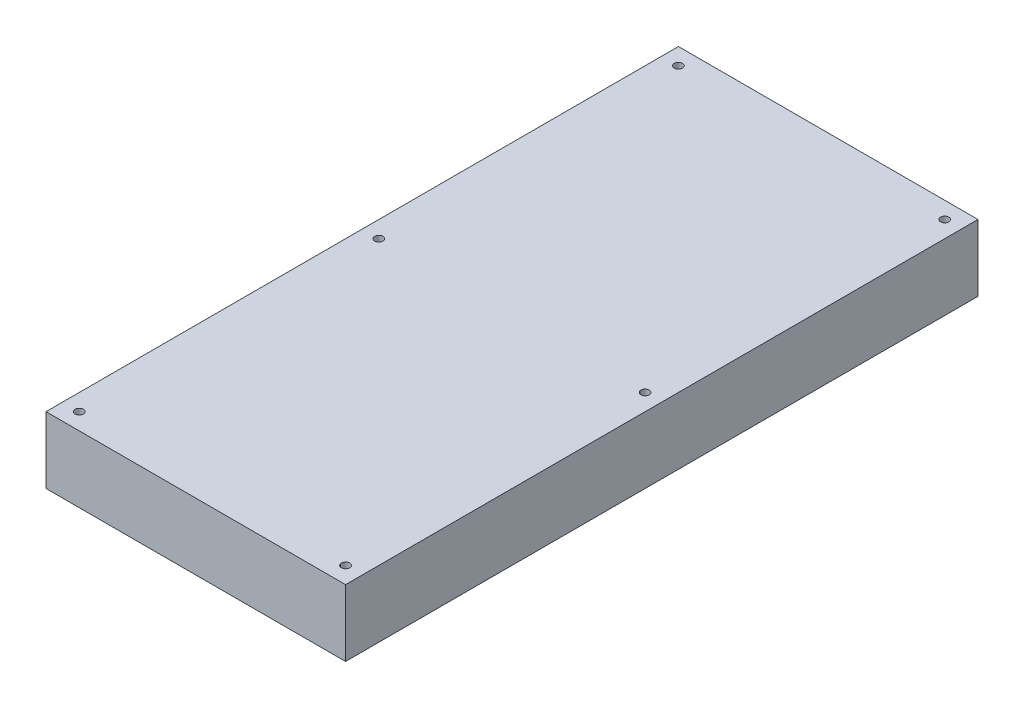
ISO-10303-21;
HEADER;
FILE_DESCRIPTION(('STEP AP214'),'2;1');
FILE_NAME('part.step','',(''),(''),'','','');
FILE_SCHEMA(('AUTOMOTIVE_DESIGN { 1 0 10303 214 1 1 1 1 }'));
ENDSEC;
DATA;
#1=APPLICATION_CONTEXT('core data for automotive mechanical design processes');
#2=APPLICATION_PROTOCOL_DEFINITION('international standard','automotive_design',2000,#1);
#3=PRODUCT_CONTEXT('',#1,'mechanical');
#4=PRODUCT('Part','Part','',(#3));
#5=PRODUCT_RELATED_PRODUCT_CATEGORY('part','',(#4));
#6=PRODUCT_DEFINITION_FORMATION('','',#4);
#7=PRODUCT_DEFINITION_CONTEXT('part definition',#1,'design');
#8=PRODUCT_DEFINITION('design','',#6,#7);
#9=PRODUCT_DEFINITION_SHAPE('','',#8);
#10=(LENGTH_UNIT() NAMED_UNIT(*) SI_UNIT(.MILLI.,.METRE.));
#11=(NAMED_UNIT(*) PLANE_ANGLE_UNIT() SI_UNIT($,.RADIAN.));
#12=(NAMED_UNIT(*) SI_UNIT($,.STERADIAN.) SOLID_ANGLE_UNIT());
#13=UNCERTAINTY_MEASURE_WITH_UNIT(LENGTH_MEASURE(1.E-05),#10,'distance_accuracy_value','');
#14=(GEOMETRIC_REPRESENTATION_CONTEXT(3) GLOBAL_UNCERTAINTY_ASSIGNED_CONTEXT((#13)) GLOBAL_UNIT_ASSIGNED_CONTEXT((#10,
#11,#12)) REPRESENTATION_CONTEXT('',''));
#15=CARTESIAN_POINT('',(0.,0.,0.));
#16=DIRECTION('',(0.,0.,1.));
#17=DIRECTION('',(1.,0.,0.));
#18=AXIS2_PLACEMENT_3D('',#15,#16,#17);
#19=CARTESIAN_POINT('',(-45.,10.,-95.));
#20=DIRECTION('',(1.,0.,0.));
#21=DIRECTION('',(0.,0.,-1.));
#22=AXIS2_PLACEMENT_3D('',#19,#20,#21);
#23=PLANE('',#22);
#24=DIRECTION('',(0.,0.,1.));
#25=VECTOR('',#24,1.);
#26=CARTESIAN_POINT('',(-45.,-10.,-95.));
#27=LINE('',#26,#25);
#28=CARTESIAN_POINT('',(-45.,-10.,-95.));
#29=VERTEX_POINT('',#28);
#30=CARTESIAN_POINT('',(-45.,-10.,95.));
#31=VERTEX_POINT('',#30);
#32=EDGE_CURVE('E95',#29,#31,#27,.T.);
#33=ORIENTED_EDGE('',*,*,#32,.T.);
#34=DIRECTION('',(0.,-1.,0.));
#35=VECTOR('',#34,1.);
#36=CARTESIAN_POINT('',(-45.,10.,95.));
#37=LINE('',#36,#35);
#38=CARTESIAN_POINT('',(-45.,10.,95.));
#39=VERTEX_POINT('',#38);
#40=EDGE_CURVE('E11',#39,#31,#37,.T.);
#41=ORIENTED_EDGE('',*,*,#40,.F.);
#42=DIRECTION('',(0.,0.,1.));
#43=VECTOR('',#42,1.);
#44=CARTESIAN_POINT('',(-45.,10.,-95.));
#45=LINE('',#44,#43);
#46=CARTESIAN_POINT('',(-45.,10.,-95.));
#47=VERTEX_POINT('',#46);
#48=EDGE_CURVE('E83',#47,#39,#45,.T.);
#49=ORIENTED_EDGE('',*,*,#48,.F.);
#50=DIRECTION('',(0.,-1.,0.));
#51=VECTOR('',#50,1.);
#52=CARTESIAN_POINT('',(-45.,10.,-95.));
#53=LINE('',#52,#51);
#54=EDGE_CURVE('E91',#47,#29,#53,.T.);
#55=ORIENTED_EDGE('',*,*,#54,.T.);
#56=EDGE_LOOP('',(#33,#41,#49,#55));
#57=FACE_BOUND('',#56,.T.);
#58=ADVANCED_FACE('F32',(#57),#23,.F.);
#59=CARTESIAN_POINT('',(45.,10.,95.));
#60=DIRECTION('',(0.,0.,-1.));
#61=DIRECTION('',(-1.,0.,0.));
#62=AXIS2_PLACEMENT_3D('',#59,#60,#61);
#63=PLANE('',#62);
#64=DIRECTION('',(1.,0.,0.));
#65=VECTOR('',#64,1.);
#66=CARTESIAN_POINT('',(45.,-10.,95.));
#67=LINE('',#66,#65);
#68=CARTESIAN_POINT('',(45.,-10.,95.));
#69=VERTEX_POINT('',#68);
#70=EDGE_CURVE('E87',#31,#69,#67,.T.);
#71=ORIENTED_EDGE('',*,*,#70,.T.);
#72=DIRECTION('',(0.,-1.,0.));
#73=VECTOR('',#72,1.);
#74=CARTESIAN_POINT('',(45.,10.,95.));
#75=LINE('',#74,#73);
#76=CARTESIAN_POINT('',(45.,10.,95.));
#77=VERTEX_POINT('',#76);
#78=EDGE_CURVE('E40',#77,#69,#75,.T.);
#79=ORIENTED_EDGE('',*,*,#78,.F.);
#80=DIRECTION('',(1.,0.,0.));
#81=VECTOR('',#80,1.);
#82=CARTESIAN_POINT('',(45.,10.,95.));
#83=LINE('',#82,#81);
#84=EDGE_CURVE('E78',#39,#77,#83,.T.);
#85=ORIENTED_EDGE('',*,*,#84,.F.);
#86=ORIENTED_EDGE('',*,*,#40,.T.);
#87=EDGE_LOOP('',(#71,#79,#85,#86));
#88=FACE_BOUND('',#87,.T.);
#89=ADVANCED_FACE('F86',(#88),#63,.F.);
#90=CARTESIAN_POINT('',(45.,10.,-95.));
#91=DIRECTION('',(-1.,0.,0.));
#92=DIRECTION('',(0.,0.,1.));
#93=AXIS2_PLACEMENT_3D('',#90,#91,#92);
#94=PLANE('',#93);
#95=DIRECTION('',(0.,0.,-1.));
#96=VECTOR('',#95,1.);
#97=CARTESIAN_POINT('',(45.,-10.,-95.));
#98=LINE('',#97,#96);
#99=CARTESIAN_POINT('',(45.,-10.,-95.));
#100=VERTEX_POINT('',#99);
#101=EDGE_CURVE('E65',#69,#100,#98,.T.);
#102=ORIENTED_EDGE('',*,*,#101,.T.);
#103=DIRECTION('',(0.,-1.,0.));
#104=VECTOR('',#103,1.);
#105=CARTESIAN_POINT('',(45.,10.,-95.));
#106=LINE('',#105,#104);
#107=CARTESIAN_POINT('',(45.,10.,-95.));
#108=VERTEX_POINT('',#107);
#109=EDGE_CURVE('E88',#108,#100,#106,.T.);
#110=ORIENTED_EDGE('',*,*,#109,.F.);
#111=DIRECTION('',(0.,0.,-1.));
#112=VECTOR('',#111,1.);
#113=CARTESIAN_POINT('',(45.,10.,-95.));
#114=LINE('',#113,#112);
#115=EDGE_CURVE('E81',#77,#108,#114,.T.);
#116=ORIENTED_EDGE('',*,*,#115,.F.);
#117=ORIENTED_EDGE('',*,*,#78,.T.);
#118=EDGE_LOOP('',(#102,#110,#116,#117));
#119=FACE_BOUND('',#118,.T.);
#120=ADVANCED_FACE('F89',(#119),#94,.F.);
#121=CARTESIAN_POINT('',(45.,10.,-95.));
#122=DIRECTION('',(0.,0.,1.));
#123=DIRECTION('',(1.,0.,0.));
#124=AXIS2_PLACEMENT_3D('',#121,#122,#123);
#125=PLANE('',#124);
#126=DIRECTION('',(-1.,0.,0.));
#127=VECTOR('',#126,1.);
#128=CARTESIAN_POINT('',(45.,-10.,-95.));
#129=LINE('',#128,#127);
#130=EDGE_CURVE('E71',#100,#29,#129,.T.);
#131=ORIENTED_EDGE('',*,*,#130,.T.);
#132=ORIENTED_EDGE('',*,*,#54,.F.);
#133=DIRECTION('',(-1.,0.,0.));
#134=VECTOR('',#133,1.);
#135=CARTESIAN_POINT('',(45.,10.,-95.));
#136=LINE('',#135,#134);
#137=EDGE_CURVE('E48',#108,#47,#136,.T.);
#138=ORIENTED_EDGE('',*,*,#137,.F.);
#139=ORIENTED_EDGE('',*,*,#109,.T.);
#140=EDGE_LOOP('',(#131,#132,#138,#139));
#141=FACE_BOUND('',#140,.T.);
#142=ADVANCED_FACE('F103',(#141),#125,.F.);
#143=CARTESIAN_POINT('',(0.,10.,0.));
#144=DIRECTION('',(0.,-1.,0.));
#145=DIRECTION('',(0.,0.,-1.));
#146=AXIS2_PLACEMENT_3D('',#143,#144,#145);
#147=PLANE('',#146);
#148=CARTESIAN_POINT('',(40.,10.,0.));
#149=DIRECTION('',(0.,1.,0.));
#150=DIRECTION('',(0.,0.,1.));
#151=AXIS2_PLACEMENT_3D('',#148,#149,#150);
#152=CIRCLE('',#151,1.25);
#153=CARTESIAN_POINT('',(40.,10.,1.25));
#154=VERTEX_POINT('',#153);
#155=EDGE_CURVE('E127',#154,#154,#152,.T.);
#156=ORIENTED_EDGE('',*,*,#155,.F.);
#157=EDGE_LOOP('',(#156));
#158=FACE_BOUND('',#157,.T.);
#159=CARTESIAN_POINT('',(40.,10.,-90.));
#160=DIRECTION('',(0.,1.,0.));
#161=DIRECTION('',(0.,0.,1.));
#162=AXIS2_PLACEMENT_3D('',#159,#160,#161);
#163=CIRCLE('',#162,1.25);
#164=CARTESIAN_POINT('',(40.,10.,-88.75));
#165=VERTEX_POINT('',#164);
#166=EDGE_CURVE('E133',#165,#165,#163,.T.);
#167=ORIENTED_EDGE('',*,*,#166,.F.);
#168=EDGE_LOOP('',(#167));
#169=FACE_BOUND('',#168,.T.);
#170=CARTESIAN_POINT('',(-40.,10.,-90.));
#171=DIRECTION('',(0.,1.,0.));
#172=DIRECTION('',(0.,0.,1.));
#173=AXIS2_PLACEMENT_3D('',#170,#171,#172);
#174=CIRCLE('',#173,1.25);
#175=CARTESIAN_POINT('',(-40.,10.,-88.75));
#176=VERTEX_POINT('',#175);
#177=EDGE_CURVE('E139',#176,#176,#174,.T.);
#178=ORIENTED_EDGE('',*,*,#177,.F.);
#179=EDGE_LOOP('',(#178));
#180=FACE_BOUND('',#179,.T.);
#181=CARTESIAN_POINT('',(-40.,10.,0.));
#182=DIRECTION('',(0.,1.,0.));
#183=DIRECTION('',(0.,0.,1.));
#184=AXIS2_PLACEMENT_3D('',#181,#182,#183);
#185=CIRCLE('',#184,1.25);
#186=CARTESIAN_POINT('',(-40.,10.,1.25));
#187=VERTEX_POINT('',#186);
#188=EDGE_CURVE('E115',#187,#187,#185,.T.);
#189=ORIENTED_EDGE('',*,*,#188,.F.);
#190=EDGE_LOOP('',(#189));
#191=FACE_BOUND('',#190,.T.);
#192=CARTESIAN_POINT('',(40.,10.,90.));
#193=DIRECTION('',(0.,1.,0.));
#194=DIRECTION('',(0.,0.,1.));
#195=AXIS2_PLACEMENT_3D('',#192,#193,#194);
#196=CIRCLE('',#195,1.25);
#197=CARTESIAN_POINT('',(40.,10.,91.25));
#198=VERTEX_POINT('',#197);
#199=EDGE_CURVE('E122',#198,#198,#196,.T.);
#200=ORIENTED_EDGE('',*,*,#199,.F.);
#201=EDGE_LOOP('',(#200));
#202=FACE_BOUND('',#201,.T.);
#203=CARTESIAN_POINT('',(-40.,10.,90.));
#204=DIRECTION('',(0.,1.,0.));
#205=DIRECTION('',(0.,0.,1.));
#206=AXIS2_PLACEMENT_3D('',#203,#204,#205);
#207=CIRCLE('',#206,1.25);
#208=CARTESIAN_POINT('',(-40.,10.,91.25));
#209=VERTEX_POINT('',#208);
#210=EDGE_CURVE('E109',#209,#209,#207,.T.);
#211=ORIENTED_EDGE('',*,*,#210,.F.);
#212=EDGE_LOOP('',(#211));
#213=FACE_BOUND('',#212,.T.);
#214=ORIENTED_EDGE('',*,*,#48,.T.);
#215=ORIENTED_EDGE('',*,*,#84,.T.);
#216=ORIENTED_EDGE('',*,*,#115,.T.);
#217=ORIENTED_EDGE('',*,*,#137,.T.);
#218=EDGE_LOOP('',(#214,#215,#216,#217));
#219=FACE_BOUND('',#218,.T.);
#220=ADVANCED_FACE('F79',(#158,#169,#180,#191,#202,#213,#219),#147,.F.);
#221=CARTESIAN_POINT('',(0.,-10.,0.));
#222=DIRECTION('',(0.,-1.,0.));
#223=DIRECTION('',(0.,0.,-1.));
#224=AXIS2_PLACEMENT_3D('',#221,#222,#223);
#225=PLANE('',#224);
#226=CARTESIAN_POINT('',(40.,-10.,0.));
#227=DIRECTION('',(0.,1.,0.));
#228=DIRECTION('',(0.,0.,1.));
#229=AXIS2_PLACEMENT_3D('',#226,#227,#228);
#230=CIRCLE('',#229,1.25);
#231=CARTESIAN_POINT('',(40.,-10.,1.25));
#232=VERTEX_POINT('',#231);
#233=EDGE_CURVE('E130',#232,#232,#230,.T.);
#234=ORIENTED_EDGE('',*,*,#233,.T.);
#235=EDGE_LOOP('',(#234));
#236=FACE_BOUND('',#235,.T.);
#237=CARTESIAN_POINT('',(40.,-10.,-90.));
#238=DIRECTION('',(0.,1.,0.));
#239=DIRECTION('',(0.,0.,1.));
#240=AXIS2_PLACEMENT_3D('',#237,#238,#239);
#241=CIRCLE('',#240,1.25);
#242=CARTESIAN_POINT('',(40.,-10.,-88.75));
#243=VERTEX_POINT('',#242);
#244=EDGE_CURVE('E136',#243,#243,#241,.T.);
#245=ORIENTED_EDGE('',*,*,#244,.T.);
#246=EDGE_LOOP('',(#245));
#247=FACE_BOUND('',#246,.T.);
#248=CARTESIAN_POINT('',(-40.,-10.,-90.));
#249=DIRECTION('',(0.,1.,0.));
#250=DIRECTION('',(0.,0.,1.));
#251=AXIS2_PLACEMENT_3D('',#248,#249,#250);
#252=CIRCLE('',#251,1.25);
#253=CARTESIAN_POINT('',(-40.,-10.,-88.75));
#254=VERTEX_POINT('',#253);
#255=EDGE_CURVE('E119',#254,#254,#252,.T.);
#256=ORIENTED_EDGE('',*,*,#255,.T.);
#257=EDGE_LOOP('',(#256));
#258=FACE_BOUND('',#257,.T.);
#259=CARTESIAN_POINT('',(-40.,-10.,0.));
#260=DIRECTION('',(0.,1.,0.));
#261=DIRECTION('',(0.,0.,1.));
#262=AXIS2_PLACEMENT_3D('',#259,#260,#261);
#263=CIRCLE('',#262,1.25);
#264=CARTESIAN_POINT('',(-40.,-10.,1.25));
#265=VERTEX_POINT('',#264);
#266=EDGE_CURVE('E118',#265,#265,#263,.T.);
#267=ORIENTED_EDGE('',*,*,#266,.T.);
#268=EDGE_LOOP('',(#267));
#269=FACE_BOUND('',#268,.T.);
#270=CARTESIAN_POINT('',(40.,-10.,90.));
#271=DIRECTION('',(0.,1.,0.));
#272=DIRECTION('',(0.,0.,1.));
#273=AXIS2_PLACEMENT_3D('',#270,#271,#272);
#274=CIRCLE('',#273,1.25);
#275=CARTESIAN_POINT('',(40.,-10.,91.25));
#276=VERTEX_POINT('',#275);
#277=EDGE_CURVE('E112',#276,#276,#274,.T.);
#278=ORIENTED_EDGE('',*,*,#277,.T.);
#279=EDGE_LOOP('',(#278));
#280=FACE_BOUND('',#279,.T.);
#281=CARTESIAN_POINT('',(-40.,-10.,90.));
#282=DIRECTION('',(0.,1.,0.));
#283=DIRECTION('',(0.,0.,1.));
#284=AXIS2_PLACEMENT_3D('',#281,#282,#283);
#285=CIRCLE('',#284,1.25);
#286=CARTESIAN_POINT('',(-40.,-10.,91.25));
#287=VERTEX_POINT('',#286);
#288=EDGE_CURVE('E98',#287,#287,#285,.T.);
#289=ORIENTED_EDGE('',*,*,#288,.T.);
#290=EDGE_LOOP('',(#289));
#291=FACE_BOUND('',#290,.T.);
#292=ORIENTED_EDGE('',*,*,#32,.F.);
#293=ORIENTED_EDGE('',*,*,#130,.F.);
#294=ORIENTED_EDGE('',*,*,#101,.F.);
#295=ORIENTED_EDGE('',*,*,#70,.F.);
#296=EDGE_LOOP('',(#292,#293,#294,#295));
#297=FACE_BOUND('',#296,.T.);
#298=ADVANCED_FACE('F106',(#236,#247,#258,#269,#280,#291,#297),#225,.T.);
#299=CARTESIAN_POINT('',(-40.,-10.,90.));
#300=DIRECTION('',(0.,1.,0.));
#301=DIRECTION('',(0.,0.,1.));
#302=AXIS2_PLACEMENT_3D('',#299,#300,#301);
#303=CYLINDRICAL_SURFACE('',#302,1.25);
#304=ORIENTED_EDGE('',*,*,#288,.F.);
#305=EDGE_LOOP('',(#304));
#306=FACE_BOUND('',#305,.T.);
#307=ORIENTED_EDGE('',*,*,#210,.T.);
#308=EDGE_LOOP('',(#307));
#309=FACE_BOUND('',#308,.T.);
#310=ADVANCED_FACE('F165',(#306,#309),#303,.F.);
#311=CARTESIAN_POINT('',(40.,-10.,90.));
#312=DIRECTION('',(0.,1.,0.));
#313=DIRECTION('',(0.,0.,1.));
#314=AXIS2_PLACEMENT_3D('',#311,#312,#313);
#315=CYLINDRICAL_SURFACE('',#314,1.25);
#316=ORIENTED_EDGE('',*,*,#277,.F.);
#317=EDGE_LOOP('',(#316));
#318=FACE_BOUND('',#317,.T.);
#319=ORIENTED_EDGE('',*,*,#199,.T.);
#320=EDGE_LOOP('',(#319));
#321=FACE_BOUND('',#320,.T.);
#322=ADVANCED_FACE('F167',(#318,#321),#315,.F.);
#323=CARTESIAN_POINT('',(-40.,-10.,0.));
#324=DIRECTION('',(0.,1.,0.));
#325=DIRECTION('',(0.,0.,1.));
#326=AXIS2_PLACEMENT_3D('',#323,#324,#325);
#327=CYLINDRICAL_SURFACE('',#326,1.25);
#328=ORIENTED_EDGE('',*,*,#266,.F.);
#329=EDGE_LOOP('',(#328));
#330=FACE_BOUND('',#329,.T.);
#331=ORIENTED_EDGE('',*,*,#188,.T.);
#332=EDGE_LOOP('',(#331));
#333=FACE_BOUND('',#332,.T.);
#334=ADVANCED_FACE('F151',(#330,#333),#327,.F.);
#335=CARTESIAN_POINT('',(-40.,-10.,-90.));
#336=DIRECTION('',(0.,1.,0.));
#337=DIRECTION('',(0.,0.,1.));
#338=AXIS2_PLACEMENT_3D('',#335,#336,#337);
#339=CYLINDRICAL_SURFACE('',#338,1.25);
#340=ORIENTED_EDGE('',*,*,#255,.F.);
#341=EDGE_LOOP('',(#340));
#342=FACE_BOUND('',#341,.T.);
#343=ORIENTED_EDGE('',*,*,#177,.T.);
#344=EDGE_LOOP('',(#343));
#345=FACE_BOUND('',#344,.T.);
#346=ADVANCED_FACE('F147',(#342,#345),#339,.F.);
#347=CARTESIAN_POINT('',(40.,-10.,-90.));
#348=DIRECTION('',(0.,1.,0.));
#349=DIRECTION('',(0.,0.,1.));
#350=AXIS2_PLACEMENT_3D('',#347,#348,#349);
#351=CYLINDRICAL_SURFACE('',#350,1.25);
#352=ORIENTED_EDGE('',*,*,#244,.F.);
#353=EDGE_LOOP('',(#352));
#354=FACE_BOUND('',#353,.T.);
#355=ORIENTED_EDGE('',*,*,#166,.T.);
#356=EDGE_LOOP('',(#355));
#357=FACE_BOUND('',#356,.T.);
#358=ADVANCED_FACE('F150',(#354,#357),#351,.F.);
#359=CARTESIAN_POINT('',(40.,-10.,0.));
#360=DIRECTION('',(0.,1.,0.));
#361=DIRECTION('',(0.,0.,1.));
#362=AXIS2_PLACEMENT_3D('',#359,#360,#361);
#363=CYLINDRICAL_SURFACE('',#362,1.25);
#364=ORIENTED_EDGE('',*,*,#233,.F.);
#365=EDGE_LOOP('',(#364));
#366=FACE_BOUND('',#365,.T.);
#367=ORIENTED_EDGE('',*,*,#155,.T.);
#368=EDGE_LOOP('',(#367));
#369=FACE_BOUND('',#368,.T.);
#370=ADVANCED_FACE('F235',(#366,#369),#363,.F.);
#371=CLOSED_SHELL('',(#58,#89,#120,#142,#220,#298,#310,#322,#334,#346,#358,#370));
#372=MANIFOLD_SOLID_BREP('B2',#371);
#373=ADVANCED_BREP_SHAPE_REPRESENTATION('',(#18,#372),#14);
#374=SHAPE_DEFINITION_REPRESENTATION(#9,#373);
ENDSEC;
END-ISO-10303-21;
